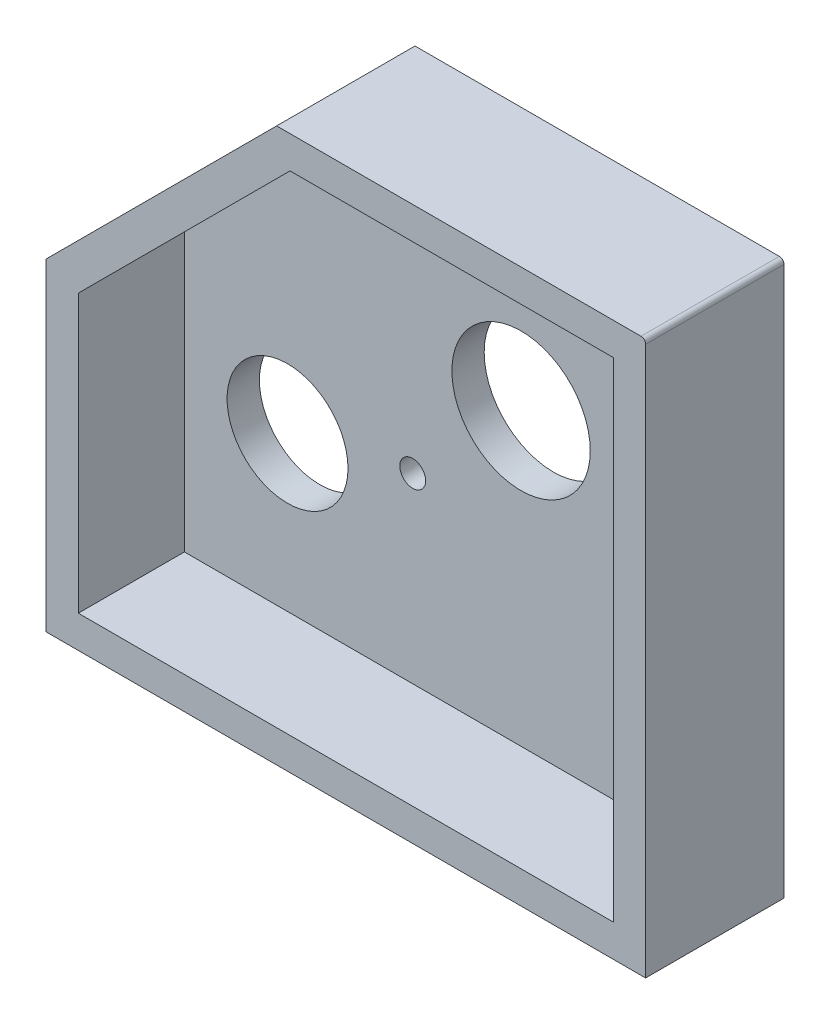
ISO-10303-21;
HEADER;
FILE_DESCRIPTION(('STEP AP214'),'2;1');
FILE_NAME('part.step','',(''),(''),'','','');
FILE_SCHEMA(('AUTOMOTIVE_DESIGN { 1 0 10303 214 1 1 1 1 }'));
ENDSEC;
DATA;
#1=APPLICATION_CONTEXT('core data for automotive mechanical design processes');
#2=APPLICATION_PROTOCOL_DEFINITION('international standard','automotive_design',2000,#1);
#3=PRODUCT_CONTEXT('',#1,'mechanical');
#4=PRODUCT('Part','Part','',(#3));
#5=PRODUCT_RELATED_PRODUCT_CATEGORY('part','',(#4));
#6=PRODUCT_DEFINITION_FORMATION('','',#4);
#7=PRODUCT_DEFINITION_CONTEXT('part definition',#1,'design');
#8=PRODUCT_DEFINITION('design','',#6,#7);
#9=PRODUCT_DEFINITION_SHAPE('','',#8);
#10=(LENGTH_UNIT() NAMED_UNIT(*) SI_UNIT(.MILLI.,.METRE.));
#11=(NAMED_UNIT(*) PLANE_ANGLE_UNIT() SI_UNIT($,.RADIAN.));
#12=(NAMED_UNIT(*) SI_UNIT($,.STERADIAN.) SOLID_ANGLE_UNIT());
#13=UNCERTAINTY_MEASURE_WITH_UNIT(LENGTH_MEASURE(1.E-05),#10,'distance_accuracy_value','');
#14=(GEOMETRIC_REPRESENTATION_CONTEXT(3) GLOBAL_UNCERTAINTY_ASSIGNED_CONTEXT((#13)) GLOBAL_UNIT_ASSIGNED_CONTEXT((#10,
#11,#12)) REPRESENTATION_CONTEXT('',''));
#15=CARTESIAN_POINT('',(0.,0.,0.));
#16=DIRECTION('',(0.,0.,1.));
#17=DIRECTION('',(1.,0.,0.));
#18=AXIS2_PLACEMENT_3D('',#15,#16,#17);
#19=CARTESIAN_POINT('',(4.91132294173039,-2.76237220732713,-13.));
#20=DIRECTION('',(0.,0.,1.));
#21=DIRECTION('',(1.,0.,0.));
#22=AXIS2_PLACEMENT_3D('',#19,#20,#21);
#23=CYLINDRICAL_SURFACE('',#22,2.80599900368879);
#24=CARTESIAN_POINT('',(4.91132294173039,-2.76237220732713,0.));
#25=DIRECTION('',(0.,0.,-1.));
#26=DIRECTION('',(-1.,0.,0.));
#27=AXIS2_PLACEMENT_3D('',#24,#25,#26);
#28=CIRCLE('',#27,2.80599900368879);
#29=CARTESIAN_POINT('',(2.1053239380416,-2.76237220732713,0.));
#30=VERTEX_POINT('',#29);
#31=EDGE_CURVE('E43',#30,#30,#28,.T.);
#32=ORIENTED_EDGE('',*,*,#31,.T.);
#33=EDGE_LOOP('',(#32));
#34=FACE_BOUND('',#33,.T.);
#35=CARTESIAN_POINT('',(4.91132294173039,-2.76237220732713,7.));
#36=DIRECTION('',(0.,0.,1.));
#37=DIRECTION('',(1.,0.,0.));
#38=AXIS2_PLACEMENT_3D('',#35,#36,#37);
#39=CIRCLE('',#38,2.80599900368879);
#40=CARTESIAN_POINT('',(7.71732194541918,-2.76237220732713,7.));
#41=VERTEX_POINT('',#40);
#42=EDGE_CURVE('E11',#41,#41,#39,.T.);
#43=ORIENTED_EDGE('',*,*,#42,.T.);
#44=EDGE_LOOP('',(#43));
#45=FACE_BOUND('',#44,.T.);
#46=ADVANCED_FACE('F36',(#34,#45),#23,.F.);
#47=CARTESIAN_POINT('',(-42.0886770582696,-2.76237220732713,-13.));
#48=DIRECTION('',(0.,0.,1.));
#49=DIRECTION('',(1.,0.,0.));
#50=AXIS2_PLACEMENT_3D('',#47,#48,#49);
#51=CYLINDRICAL_SURFACE('',#50,2.80599900368879);
#52=CARTESIAN_POINT('',(-42.0886770582696,-2.76237220732713,0.));
#53=DIRECTION('',(0.,0.,-1.));
#54=DIRECTION('',(-1.,0.,0.));
#55=AXIS2_PLACEMENT_3D('',#52,#53,#54);
#56=CIRCLE('',#55,2.80599900368879);
#57=CARTESIAN_POINT('',(-44.8946760619584,-2.76237220732713,0.));
#58=VERTEX_POINT('',#57);
#59=EDGE_CURVE('E154',#58,#58,#56,.T.);
#60=ORIENTED_EDGE('',*,*,#59,.T.);
#61=EDGE_LOOP('',(#60));
#62=FACE_BOUND('',#61,.T.);
#63=CARTESIAN_POINT('',(-42.0886770582696,-2.76237220732713,7.));
#64=DIRECTION('',(0.,0.,1.));
#65=DIRECTION('',(1.,0.,0.));
#66=AXIS2_PLACEMENT_3D('',#63,#64,#65);
#67=CIRCLE('',#66,2.80599900368879);
#68=CARTESIAN_POINT('',(-39.2826780545808,-2.76237220732713,7.));
#69=VERTEX_POINT('',#68);
#70=EDGE_CURVE('E157',#69,#69,#67,.T.);
#71=ORIENTED_EDGE('',*,*,#70,.T.);
#72=EDGE_LOOP('',(#71));
#73=FACE_BOUND('',#72,.T.);
#74=ADVANCED_FACE('F182',(#62,#73),#51,.F.);
#75=CARTESIAN_POINT('',(30.4113229417304,69.7376277926729,30.));
#76=DIRECTION('',(0.,0.,-1.));
#77=DIRECTION('',(-1.,0.,0.));
#78=AXIS2_PLACEMENT_3D('',#75,#76,#77);
#79=PLANE('',#78);
#80=DIRECTION('',(0.,1.,0.));
#81=VECTOR('',#80,1.);
#82=CARTESIAN_POINT('',(31.4113229417304,69.7376277926729,30.));
#83=LINE('',#82,#81);
#84=CARTESIAN_POINT('',(31.4113229417304,-49.2623722073271,30.));
#85=VERTEX_POINT('',#84);
#86=CARTESIAN_POINT('',(31.4113229417304,69.7376277926729,30.));
#87=VERTEX_POINT('',#86);
#88=EDGE_CURVE('E145',#85,#87,#83,.T.);
#89=ORIENTED_EDGE('',*,*,#88,.T.);
#90=CARTESIAN_POINT('',(30.4113229417304,69.7376277926729,30.));
#91=DIRECTION('',(0.,0.,1.));
#92=DIRECTION('',(-1.,0.,0.));
#93=AXIS2_PLACEMENT_3D('',#90,#91,#92);
#94=CIRCLE('',#93,1.);
#95=CARTESIAN_POINT('',(30.4113229417304,70.7376277926729,30.));
#96=VERTEX_POINT('',#95);
#97=EDGE_CURVE('E95',#87,#96,#94,.T.);
#98=ORIENTED_EDGE('',*,*,#97,.T.);
#99=DIRECTION('',(-1.,0.,0.));
#100=VECTOR('',#99,1.);
#101=CARTESIAN_POINT('',(-48.5886770582696,70.7376277926729,30.));
#102=LINE('',#101,#100);
#103=CARTESIAN_POINT('',(-48.5886770582696,70.7376277926729,30.));
#104=VERTEX_POINT('',#103);
#105=EDGE_CURVE('E112',#96,#104,#102,.T.);
#106=ORIENTED_EDGE('',*,*,#105,.T.);
#107=DIRECTION('',(-0.707106781186547,-0.707106781186547,0.));
#108=VECTOR('',#107,1.);
#109=CARTESIAN_POINT('',(-98.5886770582696,20.7376277926729,30.));
#110=LINE('',#109,#108);
#111=CARTESIAN_POINT('',(-98.5886770582696,20.7376277926729,30.));
#112=VERTEX_POINT('',#111);
#113=EDGE_CURVE('E104',#104,#112,#110,.T.);
#114=ORIENTED_EDGE('',*,*,#113,.T.);
#115=DIRECTION('',(0.,-1.,0.));
#116=VECTOR('',#115,1.);
#117=CARTESIAN_POINT('',(-98.5886770582696,20.7376277926729,30.));
#118=LINE('',#117,#116);
#119=CARTESIAN_POINT('',(-98.5886770582696,-49.2623722073271,30.));
#120=VERTEX_POINT('',#119);
#121=EDGE_CURVE('E109',#112,#120,#118,.T.);
#122=ORIENTED_EDGE('',*,*,#121,.T.);
#123=DIRECTION('',(1.,0.,0.));
#124=VECTOR('',#123,1.);
#125=CARTESIAN_POINT('',(-98.5886770582696,-49.2623722073271,30.));
#126=LINE('',#125,#124);
#127=EDGE_CURVE('E59',#120,#85,#126,.T.);
#128=ORIENTED_EDGE('',*,*,#127,.T.);
#129=EDGE_LOOP('',(#89,#98,#106,#114,#122,#128));
#130=FACE_BOUND('',#129,.T.);
#131=DIRECTION('',(0.,1.,0.));
#132=VECTOR('',#131,1.);
#133=CARTESIAN_POINT('',(24.4113229417304,69.7376277926729,30.));
#134=LINE('',#133,#132);
#135=CARTESIAN_POINT('',(24.4113229417304,-42.2623722073271,30.));
#136=VERTEX_POINT('',#135);
#137=CARTESIAN_POINT('',(24.4113229417304,63.7376277926729,30.));
#138=VERTEX_POINT('',#137);
#139=EDGE_CURVE('E385',#136,#138,#134,.T.);
#140=ORIENTED_EDGE('',*,*,#139,.F.);
#141=DIRECTION('',(1.,0.,0.));
#142=VECTOR('',#141,1.);
#143=CARTESIAN_POINT('',(30.4113229417304,-42.2623722073271,30.));
#144=LINE('',#143,#142);
#145=CARTESIAN_POINT('',(-91.5886770582696,-42.2623722073271,30.));
#146=VERTEX_POINT('',#145);
#147=EDGE_CURVE('E367',#146,#136,#144,.T.);
#148=ORIENTED_EDGE('',*,*,#147,.F.);
#149=DIRECTION('',(0.,-1.,0.));
#150=VECTOR('',#149,1.);
#151=CARTESIAN_POINT('',(-91.5886770582696,69.7376277926728,30.));
#152=LINE('',#151,#150);
#153=CARTESIAN_POINT('',(-91.5886770582696,17.8381328560612,30.));
#154=VERTEX_POINT('',#153);
#155=EDGE_CURVE('E394',#154,#146,#152,.T.);
#156=ORIENTED_EDGE('',*,*,#155,.F.);
#157=DIRECTION('',(-0.707106781186548,-0.707106781186548,0.));
#158=VECTOR('',#157,1.);
#159=CARTESIAN_POINT('',(-4.63892958996379,104.787880324367,30.));
#160=LINE('',#159,#158);
#161=CARTESIAN_POINT('',(-45.689182121658,63.7376277926729,30.));
#162=VERTEX_POINT('',#161);
#163=EDGE_CURVE('E391',#162,#154,#160,.T.);
#164=ORIENTED_EDGE('',*,*,#163,.F.);
#165=DIRECTION('',(-1.,0.,0.));
#166=VECTOR('',#165,1.);
#167=CARTESIAN_POINT('',(30.4113229417304,63.7376277926729,30.));
#168=LINE('',#167,#166);
#169=EDGE_CURVE('E388',#138,#162,#168,.T.);
#170=ORIENTED_EDGE('',*,*,#169,.F.);
#171=EDGE_LOOP('',(#140,#148,#156,#164,#170));
#172=FACE_BOUND('',#171,.T.);
#173=ADVANCED_FACE('F106',(#130,#172),#79,.F.);
#174=CARTESIAN_POINT('',(31.4113229417304,69.7376277926729,30.));
#175=DIRECTION('',(-1.,0.,0.));
#176=DIRECTION('',(0.,-1.,0.));
#177=AXIS2_PLACEMENT_3D('',#174,#175,#176);
#178=PLANE('',#177);
#179=DIRECTION('',(0.,1.,0.));
#180=VECTOR('',#179,1.);
#181=CARTESIAN_POINT('',(31.4113229417304,69.7376277926729,0.));
#182=LINE('',#181,#180);
#183=CARTESIAN_POINT('',(31.4113229417304,-49.2623722073271,0.));
#184=VERTEX_POINT('',#183);
#185=CARTESIAN_POINT('',(31.4113229417304,69.7376277926729,0.));
#186=VERTEX_POINT('',#185);
#187=EDGE_CURVE('E133',#184,#186,#182,.T.);
#188=ORIENTED_EDGE('',*,*,#187,.T.);
#189=DIRECTION('',(0.,0.,-1.));
#190=VECTOR('',#189,1.);
#191=CARTESIAN_POINT('',(31.4113229417304,69.7376277926729,30.));
#192=LINE('',#191,#190);
#193=EDGE_CURVE('E152',#87,#186,#192,.T.);
#194=ORIENTED_EDGE('',*,*,#193,.F.);
#195=ORIENTED_EDGE('',*,*,#88,.F.);
#196=DIRECTION('',(0.,0.,-1.));
#197=VECTOR('',#196,1.);
#198=CARTESIAN_POINT('',(31.4113229417304,-49.2623722073271,30.));
#199=LINE('',#198,#197);
#200=EDGE_CURVE('E129',#85,#184,#199,.T.);
#201=ORIENTED_EDGE('',*,*,#200,.T.);
#202=EDGE_LOOP('',(#188,#194,#195,#201));
#203=FACE_BOUND('',#202,.T.);
#204=ADVANCED_FACE('F190',(#203),#178,.F.);
#205=CARTESIAN_POINT('',(30.4113229417304,69.7376277926729,30.));
#206=DIRECTION('',(0.,0.,-1.));
#207=DIRECTION('',(-1.,0.,0.));
#208=AXIS2_PLACEMENT_3D('',#205,#206,#207);
#209=CYLINDRICAL_SURFACE('',#208,1.);
#210=CARTESIAN_POINT('',(30.4113229417304,69.7376277926729,0.));
#211=DIRECTION('',(0.,0.,1.));
#212=DIRECTION('',(-1.,0.,0.));
#213=AXIS2_PLACEMENT_3D('',#210,#211,#212);
#214=CIRCLE('',#213,1.);
#215=CARTESIAN_POINT('',(30.4113229417304,70.7376277926729,0.));
#216=VERTEX_POINT('',#215);
#217=EDGE_CURVE('E136',#186,#216,#214,.T.);
#218=ORIENTED_EDGE('',*,*,#217,.T.);
#219=DIRECTION('',(0.,0.,-1.));
#220=VECTOR('',#219,1.);
#221=CARTESIAN_POINT('',(30.4113229417304,70.7376277926729,30.));
#222=LINE('',#221,#220);
#223=EDGE_CURVE('E149',#96,#216,#222,.T.);
#224=ORIENTED_EDGE('',*,*,#223,.F.);
#225=ORIENTED_EDGE('',*,*,#97,.F.);
#226=ORIENTED_EDGE('',*,*,#193,.T.);
#227=EDGE_LOOP('',(#218,#224,#225,#226));
#228=FACE_BOUND('',#227,.T.);
#229=ADVANCED_FACE('F195',(#228),#209,.T.);
#230=CARTESIAN_POINT('',(-48.5886770582696,70.7376277926729,30.));
#231=DIRECTION('',(0.,-1.,0.));
#232=DIRECTION('',(0.,0.,-1.));
#233=AXIS2_PLACEMENT_3D('',#230,#231,#232);
#234=PLANE('',#233);
#235=DIRECTION('',(-1.,0.,0.));
#236=VECTOR('',#235,1.);
#237=CARTESIAN_POINT('',(-48.5886770582696,70.7376277926729,0.));
#238=LINE('',#237,#236);
#239=CARTESIAN_POINT('',(-48.5886770582696,70.7376277926729,0.));
#240=VERTEX_POINT('',#239);
#241=EDGE_CURVE('E139',#216,#240,#238,.T.);
#242=ORIENTED_EDGE('',*,*,#241,.T.);
#243=DIRECTION('',(0.,0.,-1.));
#244=VECTOR('',#243,1.);
#245=CARTESIAN_POINT('',(-48.5886770582696,70.7376277926729,30.));
#246=LINE('',#245,#244);
#247=EDGE_CURVE('E124',#104,#240,#246,.T.);
#248=ORIENTED_EDGE('',*,*,#247,.F.);
#249=ORIENTED_EDGE('',*,*,#105,.F.);
#250=ORIENTED_EDGE('',*,*,#223,.T.);
#251=EDGE_LOOP('',(#242,#248,#249,#250));
#252=FACE_BOUND('',#251,.T.);
#253=ADVANCED_FACE('F199',(#252),#234,.F.);
#254=CARTESIAN_POINT('',(-98.5886770582696,20.7376277926729,30.));
#255=DIRECTION('',(0.707106781186547,-0.707106781186547,0.));
#256=DIRECTION('',(0.707106781186548,0.707106781186548,0.));
#257=AXIS2_PLACEMENT_3D('',#254,#255,#256);
#258=PLANE('',#257);
#259=DIRECTION('',(-0.707106781186547,-0.707106781186547,0.));
#260=VECTOR('',#259,1.);
#261=CARTESIAN_POINT('',(-98.5886770582696,20.7376277926729,0.));
#262=LINE('',#261,#260);
#263=CARTESIAN_POINT('',(-98.5886770582696,20.7376277926729,0.));
#264=VERTEX_POINT('',#263);
#265=EDGE_CURVE('E121',#240,#264,#262,.T.);
#266=ORIENTED_EDGE('',*,*,#265,.T.);
#267=DIRECTION('',(0.,0.,-1.));
#268=VECTOR('',#267,1.);
#269=CARTESIAN_POINT('',(-98.5886770582696,20.7376277926729,30.));
#270=LINE('',#269,#268);
#271=EDGE_CURVE('E118',#112,#264,#270,.T.);
#272=ORIENTED_EDGE('',*,*,#271,.F.);
#273=ORIENTED_EDGE('',*,*,#113,.F.);
#274=ORIENTED_EDGE('',*,*,#247,.T.);
#275=EDGE_LOOP('',(#266,#272,#273,#274));
#276=FACE_BOUND('',#275,.T.);
#277=ADVANCED_FACE('F119',(#276),#258,.F.);
#278=CARTESIAN_POINT('',(-98.5886770582696,20.7376277926729,30.));
#279=DIRECTION('',(1.,0.,0.));
#280=DIRECTION('',(0.,1.,0.));
#281=AXIS2_PLACEMENT_3D('',#278,#279,#280);
#282=PLANE('',#281);
#283=DIRECTION('',(0.,-1.,0.));
#284=VECTOR('',#283,1.);
#285=CARTESIAN_POINT('',(-98.5886770582696,20.7376277926729,0.));
#286=LINE('',#285,#284);
#287=CARTESIAN_POINT('',(-98.5886770582696,-49.2623722073271,0.));
#288=VERTEX_POINT('',#287);
#289=EDGE_CURVE('E142',#264,#288,#286,.T.);
#290=ORIENTED_EDGE('',*,*,#289,.T.);
#291=DIRECTION('',(0.,0.,-1.));
#292=VECTOR('',#291,1.);
#293=CARTESIAN_POINT('',(-98.5886770582696,-49.2623722073271,30.));
#294=LINE('',#293,#292);
#295=EDGE_CURVE('E125',#120,#288,#294,.T.);
#296=ORIENTED_EDGE('',*,*,#295,.F.);
#297=ORIENTED_EDGE('',*,*,#121,.F.);
#298=ORIENTED_EDGE('',*,*,#271,.T.);
#299=EDGE_LOOP('',(#290,#296,#297,#298));
#300=FACE_BOUND('',#299,.T.);
#301=ADVANCED_FACE('F127',(#300),#282,.F.);
#302=CARTESIAN_POINT('',(-98.5886770582696,-49.2623722073271,30.));
#303=DIRECTION('',(0.,1.,0.));
#304=DIRECTION('',(0.,0.,1.));
#305=AXIS2_PLACEMENT_3D('',#302,#303,#304);
#306=PLANE('',#305);
#307=DIRECTION('',(1.,0.,0.));
#308=VECTOR('',#307,1.);
#309=CARTESIAN_POINT('',(-98.5886770582696,-49.2623722073271,0.));
#310=LINE('',#309,#308);
#311=EDGE_CURVE('E86',#288,#184,#310,.T.);
#312=ORIENTED_EDGE('',*,*,#311,.T.);
#313=ORIENTED_EDGE('',*,*,#200,.F.);
#314=ORIENTED_EDGE('',*,*,#127,.F.);
#315=ORIENTED_EDGE('',*,*,#295,.T.);
#316=EDGE_LOOP('',(#312,#313,#314,#315));
#317=FACE_BOUND('',#316,.T.);
#318=ADVANCED_FACE('F167',(#317),#306,.F.);
#319=CARTESIAN_POINT('',(30.4113229417304,69.7376277926729,0.));
#320=DIRECTION('',(0.,0.,-1.));
#321=DIRECTION('',(-1.,0.,0.));
#322=AXIS2_PLACEMENT_3D('',#319,#320,#321);
#323=PLANE('',#322);
#324=CARTESIAN_POINT('',(-69.2233678101076,-8.84339144831922,0.));
#325=DIRECTION('',(0.,0.,-1.));
#326=DIRECTION('',(-1.,0.,0.));
#327=AXIS2_PLACEMENT_3D('',#324,#325,#326);
#328=CIRCLE('',#327,13.1064968761033);
#329=CARTESIAN_POINT('',(-82.3298646862109,-8.84339144831922,0.));
#330=VERTEX_POINT('',#329);
#331=EDGE_CURVE('E332',#330,#330,#328,.T.);
#332=ORIENTED_EDGE('',*,*,#331,.F.);
#333=EDGE_LOOP('',(#332));
#334=FACE_BOUND('',#333,.T.);
#335=CARTESIAN_POINT('',(4.91132294173038,44.2376277926729,0.));
#336=DIRECTION('',(0.,0.,-1.));
#337=DIRECTION('',(-1.,0.,0.));
#338=AXIS2_PLACEMENT_3D('',#335,#336,#337);
#339=CIRCLE('',#338,2.80599900368879);
#340=CARTESIAN_POINT('',(2.10532393804159,44.2376277926729,0.));
#341=VERTEX_POINT('',#340);
#342=EDGE_CURVE('E337',#341,#341,#339,.T.);
#343=ORIENTED_EDGE('',*,*,#342,.F.);
#344=EDGE_LOOP('',(#343));
#345=FACE_BOUND('',#344,.T.);
#346=CARTESIAN_POINT('',(-42.0886770582696,44.2376277926729,0.));
#347=DIRECTION('',(0.,0.,-1.));
#348=DIRECTION('',(-1.,0.,0.));
#349=AXIS2_PLACEMENT_3D('',#346,#347,#348);
#350=CIRCLE('',#349,2.80599900368879);
#351=CARTESIAN_POINT('',(-44.8946760619584,44.2376277926729,0.));
#352=VERTEX_POINT('',#351);
#353=EDGE_CURVE('E348',#352,#352,#350,.T.);
#354=ORIENTED_EDGE('',*,*,#353,.F.);
#355=EDGE_LOOP('',(#354));
#356=FACE_BOUND('',#355,.T.);
#357=CARTESIAN_POINT('',(-18.5886770582696,20.7376277926729,0.));
#358=DIRECTION('',(0.,0.,-1.));
#359=DIRECTION('',(-1.,0.,0.));
#360=AXIS2_PLACEMENT_3D('',#357,#358,#359);
#361=CIRCLE('',#360,15.);
#362=CARTESIAN_POINT('',(-33.5886770582696,20.7376277926729,0.));
#363=VERTEX_POINT('',#362);
#364=EDGE_CURVE('E354',#363,#363,#361,.T.);
#365=ORIENTED_EDGE('',*,*,#364,.F.);
#366=EDGE_LOOP('',(#365));
#367=FACE_BOUND('',#366,.T.);
#368=ORIENTED_EDGE('',*,*,#187,.F.);
#369=ORIENTED_EDGE('',*,*,#311,.F.);
#370=ORIENTED_EDGE('',*,*,#289,.F.);
#371=ORIENTED_EDGE('',*,*,#265,.F.);
#372=ORIENTED_EDGE('',*,*,#241,.F.);
#373=ORIENTED_EDGE('',*,*,#217,.F.);
#374=EDGE_LOOP('',(#368,#369,#370,#371,#372,#373));
#375=FACE_BOUND('',#374,.T.);
#376=ORIENTED_EDGE('',*,*,#59,.F.);
#377=EDGE_LOOP('',(#376));
#378=FACE_BOUND('',#377,.T.);
#379=ORIENTED_EDGE('',*,*,#31,.F.);
#380=EDGE_LOOP('',(#379));
#381=FACE_BOUND('',#380,.T.);
#382=ADVANCED_FACE('F164',(#334,#345,#356,#367,#375,#378,#381),#323,.T.);
#383=CARTESIAN_POINT('',(24.4113229417304,69.7376277926729,30.));
#384=DIRECTION('',(-1.,0.,0.));
#385=DIRECTION('',(0.,-1.,0.));
#386=AXIS2_PLACEMENT_3D('',#383,#384,#385);
#387=PLANE('',#386);
#388=DIRECTION('',(0.,1.,0.));
#389=VECTOR('',#388,1.);
#390=CARTESIAN_POINT('',(24.4113229417304,69.7376277926729,7.));
#391=LINE('',#390,#389);
#392=CARTESIAN_POINT('',(24.4113229417304,-42.2623722073271,7.));
#393=VERTEX_POINT('',#392);
#394=CARTESIAN_POINT('',(24.4113229417304,63.7376277926729,7.));
#395=VERTEX_POINT('',#394);
#396=EDGE_CURVE('E357',#393,#395,#391,.T.);
#397=ORIENTED_EDGE('',*,*,#396,.F.);
#398=DIRECTION('',(0.,0.,-1.));
#399=VECTOR('',#398,1.);
#400=CARTESIAN_POINT('',(24.4113229417304,-42.2623722073271,30.));
#401=LINE('',#400,#399);
#402=EDGE_CURVE('E364',#136,#393,#401,.T.);
#403=ORIENTED_EDGE('',*,*,#402,.F.);
#404=ORIENTED_EDGE('',*,*,#139,.T.);
#405=DIRECTION('',(0.,0.,-1.));
#406=VECTOR('',#405,1.);
#407=CARTESIAN_POINT('',(24.4113229417304,63.7376277926729,30.));
#408=LINE('',#407,#406);
#409=EDGE_CURVE('E137',#138,#395,#408,.T.);
#410=ORIENTED_EDGE('',*,*,#409,.T.);
#411=EDGE_LOOP('',(#397,#403,#404,#410));
#412=FACE_BOUND('',#411,.T.);
#413=ADVANCED_FACE('F166',(#412),#387,.T.);
#414=CARTESIAN_POINT('',(-48.5886770582696,63.7376277926729,30.));
#415=DIRECTION('',(0.,-1.,0.));
#416=DIRECTION('',(0.,0.,-1.));
#417=AXIS2_PLACEMENT_3D('',#414,#415,#416);
#418=PLANE('',#417);
#419=DIRECTION('',(-1.,0.,0.));
#420=VECTOR('',#419,1.);
#421=CARTESIAN_POINT('',(30.4113229417304,63.7376277926729,7.));
#422=LINE('',#421,#420);
#423=CARTESIAN_POINT('',(-45.689182121658,63.7376277926729,7.));
#424=VERTEX_POINT('',#423);
#425=EDGE_CURVE('E360',#395,#424,#422,.T.);
#426=ORIENTED_EDGE('',*,*,#425,.F.);
#427=ORIENTED_EDGE('',*,*,#409,.F.);
#428=ORIENTED_EDGE('',*,*,#169,.T.);
#429=DIRECTION('',(0.,0.,-1.));
#430=VECTOR('',#429,1.);
#431=CARTESIAN_POINT('',(-45.689182121658,63.7376277926729,30.));
#432=LINE('',#431,#430);
#433=EDGE_CURVE('E363',#162,#424,#432,.T.);
#434=ORIENTED_EDGE('',*,*,#433,.T.);
#435=EDGE_LOOP('',(#426,#427,#428,#434));
#436=FACE_BOUND('',#435,.T.);
#437=ADVANCED_FACE('F174',(#436),#418,.T.);
#438=CARTESIAN_POINT('',(-93.6389295899638,15.787880324367,30.));
#439=DIRECTION('',(0.707106781186547,-0.707106781186547,0.));
#440=DIRECTION('',(0.707106781186548,0.707106781186548,0.));
#441=AXIS2_PLACEMENT_3D('',#438,#439,#440);
#442=PLANE('',#441);
#443=DIRECTION('',(-0.707106781186548,-0.707106781186548,0.));
#444=VECTOR('',#443,1.);
#445=CARTESIAN_POINT('',(-4.63892958996379,104.787880324367,7.));
#446=LINE('',#445,#444);
#447=CARTESIAN_POINT('',(-91.5886770582696,17.8381328560612,7.));
#448=VERTEX_POINT('',#447);
#449=EDGE_CURVE('E370',#424,#448,#446,.T.);
#450=ORIENTED_EDGE('',*,*,#449,.F.);
#451=ORIENTED_EDGE('',*,*,#433,.F.);
#452=ORIENTED_EDGE('',*,*,#163,.T.);
#453=DIRECTION('',(0.,0.,-1.));
#454=VECTOR('',#453,1.);
#455=CARTESIAN_POINT('',(-91.5886770582696,17.8381328560612,30.));
#456=LINE('',#455,#454);
#457=EDGE_CURVE('E373',#154,#448,#456,.T.);
#458=ORIENTED_EDGE('',*,*,#457,.T.);
#459=EDGE_LOOP('',(#450,#451,#452,#458));
#460=FACE_BOUND('',#459,.T.);
#461=ADVANCED_FACE('F236',(#460),#442,.T.);
#462=CARTESIAN_POINT('',(-91.5886770582696,20.7376277926729,30.));
#463=DIRECTION('',(1.,0.,0.));
#464=DIRECTION('',(0.,1.,0.));
#465=AXIS2_PLACEMENT_3D('',#462,#463,#464);
#466=PLANE('',#465);
#467=DIRECTION('',(0.,-1.,0.));
#468=VECTOR('',#467,1.);
#469=CARTESIAN_POINT('',(-91.5886770582696,69.7376277926728,7.));
#470=LINE('',#469,#468);
#471=CARTESIAN_POINT('',(-91.5886770582696,-42.2623722073271,7.));
#472=VERTEX_POINT('',#471);
#473=EDGE_CURVE('E376',#448,#472,#470,.T.);
#474=ORIENTED_EDGE('',*,*,#473,.F.);
#475=ORIENTED_EDGE('',*,*,#457,.F.);
#476=ORIENTED_EDGE('',*,*,#155,.T.);
#477=DIRECTION('',(0.,0.,-1.));
#478=VECTOR('',#477,1.);
#479=CARTESIAN_POINT('',(-91.5886770582696,-42.2623722073271,30.));
#480=LINE('',#479,#478);
#481=EDGE_CURVE('E50',#146,#472,#480,.T.);
#482=ORIENTED_EDGE('',*,*,#481,.T.);
#483=EDGE_LOOP('',(#474,#475,#476,#482));
#484=FACE_BOUND('',#483,.T.);
#485=ADVANCED_FACE('F246',(#484),#466,.T.);
#486=CARTESIAN_POINT('',(-98.5886770582696,-42.2623722073271,30.));
#487=DIRECTION('',(0.,1.,0.));
#488=DIRECTION('',(0.,0.,1.));
#489=AXIS2_PLACEMENT_3D('',#486,#487,#488);
#490=PLANE('',#489);
#491=DIRECTION('',(1.,0.,0.));
#492=VECTOR('',#491,1.);
#493=CARTESIAN_POINT('',(30.4113229417304,-42.2623722073271,7.));
#494=LINE('',#493,#492);
#495=EDGE_CURVE('E381',#472,#393,#494,.T.);
#496=ORIENTED_EDGE('',*,*,#495,.F.);
#497=ORIENTED_EDGE('',*,*,#481,.F.);
#498=ORIENTED_EDGE('',*,*,#147,.T.);
#499=ORIENTED_EDGE('',*,*,#402,.T.);
#500=EDGE_LOOP('',(#496,#497,#498,#499));
#501=FACE_BOUND('',#500,.T.);
#502=ADVANCED_FACE('F256',(#501),#490,.T.);
#503=CARTESIAN_POINT('',(30.4113229417304,69.7376277926729,7.));
#504=DIRECTION('',(0.,0.,-1.));
#505=DIRECTION('',(-1.,0.,0.));
#506=AXIS2_PLACEMENT_3D('',#503,#504,#505);
#507=PLANE('',#506);
#508=CARTESIAN_POINT('',(-69.2233678101076,-8.84339144831922,7.));
#509=DIRECTION('',(0.,0.,1.));
#510=DIRECTION('',(1.,0.,0.));
#511=AXIS2_PLACEMENT_3D('',#508,#509,#510);
#512=CIRCLE('',#511,13.1064968761033);
#513=CARTESIAN_POINT('',(-56.1168709340043,-8.84339144831922,7.));
#514=VERTEX_POINT('',#513);
#515=EDGE_CURVE('E335',#514,#514,#512,.T.);
#516=ORIENTED_EDGE('',*,*,#515,.F.);
#517=EDGE_LOOP('',(#516));
#518=FACE_BOUND('',#517,.T.);
#519=CARTESIAN_POINT('',(4.91132294173038,44.2376277926729,7.));
#520=DIRECTION('',(0.,0.,1.));
#521=DIRECTION('',(1.,0.,0.));
#522=AXIS2_PLACEMENT_3D('',#519,#520,#521);
#523=CIRCLE('',#522,2.80599900368879);
#524=CARTESIAN_POINT('',(7.71732194541917,44.2376277926729,7.));
#525=VERTEX_POINT('',#524);
#526=EDGE_CURVE('E342',#525,#525,#523,.T.);
#527=ORIENTED_EDGE('',*,*,#526,.F.);
#528=EDGE_LOOP('',(#527));
#529=FACE_BOUND('',#528,.T.);
#530=CARTESIAN_POINT('',(-42.0886770582696,44.2376277926729,7.));
#531=DIRECTION('',(0.,0.,1.));
#532=DIRECTION('',(1.,0.,0.));
#533=AXIS2_PLACEMENT_3D('',#530,#531,#532);
#534=CIRCLE('',#533,2.80599900368879);
#535=CARTESIAN_POINT('',(-39.2826780545808,44.2376277926729,7.));
#536=VERTEX_POINT('',#535);
#537=EDGE_CURVE('E345',#536,#536,#534,.T.);
#538=ORIENTED_EDGE('',*,*,#537,.F.);
#539=EDGE_LOOP('',(#538));
#540=FACE_BOUND('',#539,.T.);
#541=CARTESIAN_POINT('',(-18.5886770582696,20.7376277926729,7.));
#542=DIRECTION('',(0.,0.,1.));
#543=DIRECTION('',(1.,0.,0.));
#544=AXIS2_PLACEMENT_3D('',#541,#542,#543);
#545=CIRCLE('',#544,15.);
#546=CARTESIAN_POINT('',(-3.58867705826963,20.7376277926729,7.));
#547=VERTEX_POINT('',#546);
#548=EDGE_CURVE('E351',#547,#547,#545,.T.);
#549=ORIENTED_EDGE('',*,*,#548,.F.);
#550=EDGE_LOOP('',(#549));
#551=FACE_BOUND('',#550,.T.);
#552=ORIENTED_EDGE('',*,*,#396,.T.);
#553=ORIENTED_EDGE('',*,*,#425,.T.);
#554=ORIENTED_EDGE('',*,*,#449,.T.);
#555=ORIENTED_EDGE('',*,*,#473,.T.);
#556=ORIENTED_EDGE('',*,*,#495,.T.);
#557=EDGE_LOOP('',(#552,#553,#554,#555,#556));
#558=FACE_BOUND('',#557,.T.);
#559=ORIENTED_EDGE('',*,*,#70,.F.);
#560=EDGE_LOOP('',(#559));
#561=FACE_BOUND('',#560,.T.);
#562=ORIENTED_EDGE('',*,*,#42,.F.);
#563=EDGE_LOOP('',(#562));
#564=FACE_BOUND('',#563,.T.);
#565=ADVANCED_FACE('F266',(#518,#529,#540,#551,#558,#561,#564),#507,.F.);
#566=CARTESIAN_POINT('',(-18.5886770582696,20.7376277926729,-13.));
#567=DIRECTION('',(0.,0.,1.));
#568=DIRECTION('',(1.,0.,0.));
#569=AXIS2_PLACEMENT_3D('',#566,#567,#568);
#570=CYLINDRICAL_SURFACE('',#569,15.);
#571=ORIENTED_EDGE('',*,*,#364,.T.);
#572=EDGE_LOOP('',(#571));
#573=FACE_BOUND('',#572,.T.);
#574=ORIENTED_EDGE('',*,*,#548,.T.);
#575=EDGE_LOOP('',(#574));
#576=FACE_BOUND('',#575,.T.);
#577=ADVANCED_FACE('F273',(#573,#576),#570,.F.);
#578=CARTESIAN_POINT('',(-42.0886770582696,44.2376277926729,-13.));
#579=DIRECTION('',(0.,0.,1.));
#580=DIRECTION('',(1.,0.,0.));
#581=AXIS2_PLACEMENT_3D('',#578,#579,#580);
#582=CYLINDRICAL_SURFACE('',#581,2.80599900368879);
#583=ORIENTED_EDGE('',*,*,#353,.T.);
#584=EDGE_LOOP('',(#583));
#585=FACE_BOUND('',#584,.T.);
#586=ORIENTED_EDGE('',*,*,#537,.T.);
#587=EDGE_LOOP('',(#586));
#588=FACE_BOUND('',#587,.T.);
#589=ADVANCED_FACE('F278',(#585,#588),#582,.F.);
#590=CARTESIAN_POINT('',(4.91132294173038,44.2376277926729,-13.));
#591=DIRECTION('',(0.,0.,1.));
#592=DIRECTION('',(1.,0.,0.));
#593=AXIS2_PLACEMENT_3D('',#590,#591,#592);
#594=CYLINDRICAL_SURFACE('',#593,2.80599900368879);
#595=ORIENTED_EDGE('',*,*,#342,.T.);
#596=EDGE_LOOP('',(#595));
#597=FACE_BOUND('',#596,.T.);
#598=ORIENTED_EDGE('',*,*,#526,.T.);
#599=EDGE_LOOP('',(#598));
#600=FACE_BOUND('',#599,.T.);
#601=ADVANCED_FACE('F287',(#597,#600),#594,.F.);
#602=CARTESIAN_POINT('',(-69.2233678101076,-8.84339144831922,-13.));
#603=DIRECTION('',(0.,0.,1.));
#604=DIRECTION('',(1.,0.,0.));
#605=AXIS2_PLACEMENT_3D('',#602,#603,#604);
#606=CYLINDRICAL_SURFACE('',#605,13.1064968761033);
#607=ORIENTED_EDGE('',*,*,#331,.T.);
#608=EDGE_LOOP('',(#607));
#609=FACE_BOUND('',#608,.T.);
#610=ORIENTED_EDGE('',*,*,#515,.T.);
#611=EDGE_LOOP('',(#610));
#612=FACE_BOUND('',#611,.T.);
#613=ADVANCED_FACE('F305',(#609,#612),#606,.F.);
#614=CLOSED_SHELL('',(#46,#74,#173,#204,#229,#253,#277,#301,#318,#382,#413,#437,#461,#485,#502,
#565,#577,#589,#601,#613));
#615=MANIFOLD_SOLID_BREP('B2',#614);
#616=ADVANCED_BREP_SHAPE_REPRESENTATION('',(#18,#615),#14);
#617=SHAPE_DEFINITION_REPRESENTATION(#9,#616);
ENDSEC;
END-ISO-10303-21;
